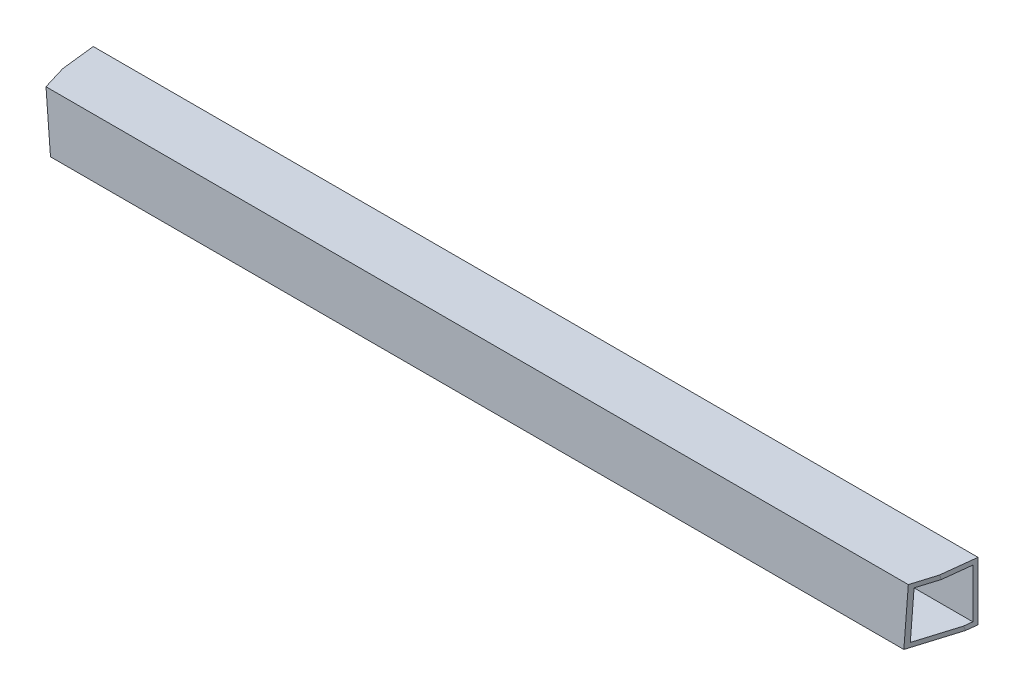
ISO-10303-21;
HEADER;
FILE_DESCRIPTION(('STEP AP214'),'2;1');
FILE_NAME('part.step','',(''),(''),'','','');
FILE_SCHEMA(('AUTOMOTIVE_DESIGN { 1 0 10303 214 1 1 1 1 }'));
ENDSEC;
DATA;
#1=APPLICATION_CONTEXT('core data for automotive mechanical design processes');
#2=APPLICATION_PROTOCOL_DEFINITION('international standard','automotive_design',2000,#1);
#3=PRODUCT_CONTEXT('',#1,'mechanical');
#4=PRODUCT('Part','Part','',(#3));
#5=PRODUCT_RELATED_PRODUCT_CATEGORY('part','',(#4));
#6=PRODUCT_DEFINITION_FORMATION('','',#4);
#7=PRODUCT_DEFINITION_CONTEXT('part definition',#1,'design');
#8=PRODUCT_DEFINITION('design','',#6,#7);
#9=PRODUCT_DEFINITION_SHAPE('','',#8);
#10=(LENGTH_UNIT() NAMED_UNIT(*) SI_UNIT(.MILLI.,.METRE.));
#11=(NAMED_UNIT(*) PLANE_ANGLE_UNIT() SI_UNIT($,.RADIAN.));
#12=(NAMED_UNIT(*) SI_UNIT($,.STERADIAN.) SOLID_ANGLE_UNIT());
#13=UNCERTAINTY_MEASURE_WITH_UNIT(LENGTH_MEASURE(1.E-05),#10,'distance_accuracy_value','');
#14=(GEOMETRIC_REPRESENTATION_CONTEXT(3) GLOBAL_UNCERTAINTY_ASSIGNED_CONTEXT((#13)) GLOBAL_UNIT_ASSIGNED_CONTEXT((#10,
#11,#12)) REPRESENTATION_CONTEXT('',''));
#15=CARTESIAN_POINT('',(0.,0.,0.));
#16=DIRECTION('',(0.,0.,1.));
#17=DIRECTION('',(1.,0.,0.));
#18=AXIS2_PLACEMENT_3D('',#15,#16,#17);
#19=CARTESIAN_POINT('',(-160.285714285715,-9.99999999999998,-924.999999999999));
#20=DIRECTION('',(0.,0.,1.));
#21=DIRECTION('',(1.,0.,0.));
#22=AXIS2_PLACEMENT_3D('',#19,#20,#21);
#23=PLANE('',#22);
#24=DIRECTION('',(0.,1.,0.));
#25=VECTOR('',#24,1.);
#26=CARTESIAN_POINT('',(151.363477169252,-9.99999999999998,-924.999999999999));
#27=LINE('',#26,#25);
#28=CARTESIAN_POINT('',(151.363477169252,-10.,-924.999999999999));
#29=VERTEX_POINT('',#28);
#30=CARTESIAN_POINT('',(151.363477169252,10.,-924.999999999999));
#31=VERTEX_POINT('',#30);
#32=EDGE_CURVE('E127',#29,#31,#27,.T.);
#33=ORIENTED_EDGE('',*,*,#32,.F.);
#34=DIRECTION('',(1.,0.,0.));
#35=VECTOR('',#34,1.);
#36=CARTESIAN_POINT('',(-160.285714285715,-9.99999999999998,-924.999999999999));
#37=LINE('',#36,#35);
#38=CARTESIAN_POINT('',(-151.363477169252,-10.,-924.999999999999));
#39=VERTEX_POINT('',#38);
#40=EDGE_CURVE('E138',#39,#29,#37,.T.);
#41=ORIENTED_EDGE('',*,*,#40,.F.);
#42=DIRECTION('',(0.,-1.,0.));
#43=VECTOR('',#42,1.);
#44=CARTESIAN_POINT('',(-151.363477169252,-9.99999999999998,-924.999999999999));
#45=LINE('',#44,#43);
#46=CARTESIAN_POINT('',(-151.363477169252,10.,-924.999999999999));
#47=VERTEX_POINT('',#46);
#48=EDGE_CURVE('E188',#47,#39,#45,.T.);
#49=ORIENTED_EDGE('',*,*,#48,.F.);
#50=DIRECTION('',(1.,0.,0.));
#51=VECTOR('',#50,1.);
#52=CARTESIAN_POINT('',(-160.285714285715,10.,-924.999999999999));
#53=LINE('',#52,#51);
#54=EDGE_CURVE('E140',#47,#31,#53,.T.);
#55=ORIENTED_EDGE('',*,*,#54,.T.);
#56=EDGE_LOOP('',(#33,#41,#49,#55));
#57=FACE_BOUND('',#56,.T.);
#58=ADVANCED_FACE('F39',(#57),#23,.F.);
#59=CARTESIAN_POINT('',(-160.285714285715,10.,-904.999999999999));
#60=DIRECTION('',(0.,-1.,0.));
#61=DIRECTION('',(1.,0.,0.));
#62=AXIS2_PLACEMENT_3D('',#59,#60,#61);
#63=PLANE('',#62);
#64=DIRECTION('',(-0.113546591160732,0.,0.993532672656404));
#65=VECTOR('',#64,1.);
#66=CARTESIAN_POINT('',(240.064673273436,10.,-1701.13546591161));
#67=LINE('',#66,#65);
#68=CARTESIAN_POINT('',(150.010616599401,10.,-913.162470013793));
#69=VERTEX_POINT('',#68);
#70=EDGE_CURVE('E132',#31,#69,#67,.T.);
#71=ORIENTED_EDGE('',*,*,#70,.F.);
#72=ORIENTED_EDGE('',*,*,#54,.F.);
#73=DIRECTION('',(0.113546591160732,0.,0.993532672656404));
#74=VECTOR('',#73,1.);
#75=CARTESIAN_POINT('',(-240.064673273436,10.,-1701.13546591161));
#76=LINE('',#75,#74);
#77=CARTESIAN_POINT('',(-150.0106165994,10.,-913.162470013789));
#78=VERTEX_POINT('',#77);
#79=EDGE_CURVE('E156',#47,#78,#76,.T.);
#80=ORIENTED_EDGE('',*,*,#79,.T.);
#81=DIRECTION('',(-0.291328168163367,0.,-0.956623174732129));
#82=VECTOR('',#81,1.);
#83=CARTESIAN_POINT('',(-148.607876541253,10.,-908.556346080738));
#84=LINE('',#83,#82);
#85=CARTESIAN_POINT('',(-147.52483379629,10.,-904.999999999999));
#86=VERTEX_POINT('',#85);
#87=EDGE_CURVE('E204',#86,#78,#84,.T.);
#88=ORIENTED_EDGE('',*,*,#87,.F.);
#89=DIRECTION('',(1.,0.,0.));
#90=VECTOR('',#89,1.);
#91=CARTESIAN_POINT('',(-160.285714285715,10.,-904.999999999999));
#92=LINE('',#91,#90);
#93=CARTESIAN_POINT('',(147.52483379629,10.,-904.999999999999));
#94=VERTEX_POINT('',#93);
#95=EDGE_CURVE('E157',#86,#94,#92,.T.);
#96=ORIENTED_EDGE('',*,*,#95,.T.);
#97=DIRECTION('',(-0.291328168163365,0.,0.956623174732129));
#98=VECTOR('',#97,1.);
#99=CARTESIAN_POINT('',(121.400305696566,10.,-819.215885244839));
#100=LINE('',#99,#98);
#101=EDGE_CURVE('E48',#69,#94,#100,.T.);
#102=ORIENTED_EDGE('',*,*,#101,.F.);
#103=EDGE_LOOP('',(#71,#72,#80,#88,#96,#102));
#104=FACE_BOUND('',#103,.T.);
#105=ADVANCED_FACE('F225',(#104),#63,.F.);
#106=CARTESIAN_POINT('',(-160.285714285715,-8.39999999999996,-906.599999999999));
#107=DIRECTION('',(0.,1.,0.));
#108=DIRECTION('',(0.,0.,1.));
#109=AXIS2_PLACEMENT_3D('',#106,#107,#108);
#110=PLANE('',#109);
#111=DIRECTION('',(0.291328168163365,0.,-0.956623174732129));
#112=VECTOR('',#111,1.);
#113=CARTESIAN_POINT('',(120.556458023637,-8.39999999999982,-821.072868980187));
#114=LINE('',#113,#112);
#115=CARTESIAN_POINT('',(146.602724794507,-8.39999999999996,-906.599999999999));
#116=VERTEX_POINT('',#115);
#117=CARTESIAN_POINT('',(150.857233460837,-8.39999999999996,-920.570367551372));
#118=VERTEX_POINT('',#117);
#119=EDGE_CURVE('E160',#116,#118,#114,.T.);
#120=ORIENTED_EDGE('',*,*,#119,.T.);
#121=DIRECTION('',(0.113546591160732,0.,-0.993532672656404));
#122=VECTOR('',#121,1.);
#123=CARTESIAN_POINT('',(145.269692267335,-8.39999999999991,-871.679382108222));
#124=LINE('',#123,#122);
#125=CARTESIAN_POINT('',(151.180620026395,-8.39999999999999,-923.399999999999));
#126=VERTEX_POINT('',#125);
#127=EDGE_CURVE('E219',#118,#126,#124,.T.);
#128=ORIENTED_EDGE('',*,*,#127,.T.);
#129=DIRECTION('',(1.,0.,0.));
#130=VECTOR('',#129,1.);
#131=CARTESIAN_POINT('',(-160.285714285715,-8.39999999999999,-923.399999999999));
#132=LINE('',#131,#130);
#133=CARTESIAN_POINT('',(-151.180620026395,-8.39999999999999,-923.399999999999));
#134=VERTEX_POINT('',#133);
#135=EDGE_CURVE('E166',#134,#126,#132,.T.);
#136=ORIENTED_EDGE('',*,*,#135,.F.);
#137=DIRECTION('',(0.113546591160732,0.,0.993532672656404));
#138=VECTOR('',#137,1.);
#139=CARTESIAN_POINT('',(-149.40276467438,-8.39999999999996,-907.843765669866));
#140=LINE('',#139,#138);
#141=CARTESIAN_POINT('',(-150.857233460838,-8.39999999999999,-920.570367551374));
#142=VERTEX_POINT('',#141);
#143=EDGE_CURVE('E181',#134,#142,#140,.T.);
#144=ORIENTED_EDGE('',*,*,#143,.T.);
#145=DIRECTION('',(0.291328168163366,0.,0.956623174732129));
#146=VECTOR('',#145,1.);
#147=CARTESIAN_POINT('',(-147.764028868323,-8.39999999999997,-910.413329816087));
#148=LINE('',#147,#146);
#149=CARTESIAN_POINT('',(-146.602724794507,-8.39999999999996,-906.599999999999));
#150=VERTEX_POINT('',#149);
#151=EDGE_CURVE('E152',#142,#150,#148,.T.);
#152=ORIENTED_EDGE('',*,*,#151,.T.);
#153=DIRECTION('',(1.,0.,0.));
#154=VECTOR('',#153,1.);
#155=CARTESIAN_POINT('',(-160.285714285715,-8.39999999999996,-906.599999999999));
#156=LINE('',#155,#154);
#157=EDGE_CURVE('E148',#150,#116,#156,.T.);
#158=ORIENTED_EDGE('',*,*,#157,.T.);
#159=EDGE_LOOP('',(#120,#128,#136,#144,#152,#158));
#160=FACE_BOUND('',#159,.T.);
#161=ADVANCED_FACE('F249',(#160),#110,.T.);
#162=CARTESIAN_POINT('',(-160.285714285715,-9.99999999999998,-904.999999999999));
#163=DIRECTION('',(0.,1.,0.));
#164=DIRECTION('',(-1.,0.,0.));
#165=AXIS2_PLACEMENT_3D('',#162,#163,#164);
#166=PLANE('',#165);
#167=DIRECTION('',(-0.113546591160732,0.,0.993532672656404));
#168=VECTOR('',#167,1.);
#169=CARTESIAN_POINT('',(240.064673273436,-10.,-1701.13546591161));
#170=LINE('',#169,#168);
#171=CARTESIAN_POINT('',(150.930852318355,-10.,-921.214532554648));
#172=VERTEX_POINT('',#171);
#173=EDGE_CURVE('E123',#29,#172,#170,.T.);
#174=ORIENTED_EDGE('',*,*,#173,.T.);
#175=DIRECTION('',(0.291328168163365,0.,-0.956623174732129));
#176=VECTOR('',#175,1.);
#177=CARTESIAN_POINT('',(119.998399483178,-9.99999999999998,-819.642819046853));
#178=LINE('',#177,#176);
#179=CARTESIAN_POINT('',(145.992909990026,-9.99999999999998,-904.999999999999));
#180=VERTEX_POINT('',#179);
#181=EDGE_CURVE('E183',#180,#172,#178,.T.);
#182=ORIENTED_EDGE('',*,*,#181,.F.);
#183=DIRECTION('',(1.,0.,0.));
#184=VECTOR('',#183,1.);
#185=CARTESIAN_POINT('',(-160.285714285715,-9.99999999999998,-904.999999999999));
#186=LINE('',#185,#184);
#187=CARTESIAN_POINT('',(-145.992909990026,-9.99999999999998,-904.999999999999));
#188=VERTEX_POINT('',#187);
#189=EDGE_CURVE('E161',#188,#180,#186,.T.);
#190=ORIENTED_EDGE('',*,*,#189,.F.);
#191=DIRECTION('',(0.291328168163367,0.,0.956623174732129));
#192=VECTOR('',#191,1.);
#193=CARTESIAN_POINT('',(-147.205970327865,-9.99999999999998,-908.983279882753));
#194=LINE('',#193,#192);
#195=CARTESIAN_POINT('',(-150.930852318354,-10.,-921.214532554642));
#196=VERTEX_POINT('',#195);
#197=EDGE_CURVE('E193',#196,#188,#194,.T.);
#198=ORIENTED_EDGE('',*,*,#197,.F.);
#199=DIRECTION('',(0.113546591160732,0.,0.993532672656404));
#200=VECTOR('',#199,1.);
#201=CARTESIAN_POINT('',(-240.064673273436,-10.,-1701.13546591161));
#202=LINE('',#201,#200);
#203=EDGE_CURVE('E146',#39,#196,#202,.T.);
#204=ORIENTED_EDGE('',*,*,#203,.F.);
#205=ORIENTED_EDGE('',*,*,#40,.T.);
#206=EDGE_LOOP('',(#174,#182,#190,#198,#204,#205));
#207=FACE_BOUND('',#206,.T.);
#208=ADVANCED_FACE('F144',(#207),#166,.F.);
#209=CARTESIAN_POINT('',(-160.285714285715,8.40000000000002,-906.599999999999));
#210=DIRECTION('',(0.,-1.,0.));
#211=DIRECTION('',(1.,0.,0.));
#212=AXIS2_PLACEMENT_3D('',#209,#210,#211);
#213=PLANE('',#212);
#214=DIRECTION('',(1.,0.,0.));
#215=VECTOR('',#214,1.);
#216=CARTESIAN_POINT('',(-160.285714285715,8.40000000000002,-923.399999999999));
#217=LINE('',#216,#215);
#218=CARTESIAN_POINT('',(-151.180620026395,8.40000000000002,-923.399999999999));
#219=VERTEX_POINT('',#218);
#220=CARTESIAN_POINT('',(151.180620026395,8.40000000000002,-923.399999999999));
#221=VERTEX_POINT('',#220);
#222=EDGE_CURVE('E168',#219,#221,#217,.T.);
#223=ORIENTED_EDGE('',*,*,#222,.T.);
#224=DIRECTION('',(-0.113546591160732,0.,0.993532672656404));
#225=VECTOR('',#224,1.);
#226=CARTESIAN_POINT('',(145.269692267335,8.40000000000002,-871.679382108222));
#227=LINE('',#226,#225);
#228=CARTESIAN_POINT('',(150.084235456915,8.40000000000002,-913.806635017051));
#229=VERTEX_POINT('',#228);
#230=EDGE_CURVE('E213',#221,#229,#227,.T.);
#231=ORIENTED_EDGE('',*,*,#230,.T.);
#232=DIRECTION('',(-0.291328168163365,0.,0.956623174732129));
#233=VECTOR('',#232,1.);
#234=CARTESIAN_POINT('',(121.734059242883,8.40000000000002,-820.714244586495));
#235=LINE('',#234,#233);
#236=CARTESIAN_POINT('',(147.889540791769,8.40000000000002,-906.599999999999));
#237=VERTEX_POINT('',#236);
#238=EDGE_CURVE('E147',#229,#237,#235,.T.);
#239=ORIENTED_EDGE('',*,*,#238,.T.);
#240=DIRECTION('',(1.,0.,0.));
#241=VECTOR('',#240,1.);
#242=CARTESIAN_POINT('',(-160.285714285715,8.40000000000002,-906.599999999999));
#243=LINE('',#242,#241);
#244=CARTESIAN_POINT('',(-147.889540791769,8.40000000000002,-906.599999999999));
#245=VERTEX_POINT('',#244);
#246=EDGE_CURVE('E164',#245,#237,#243,.T.);
#247=ORIENTED_EDGE('',*,*,#246,.F.);
#248=DIRECTION('',(-0.291328168163367,0.,-0.956623174732129));
#249=VECTOR('',#248,1.);
#250=CARTESIAN_POINT('',(-148.94163008757,8.40000000000002,-910.054705422395));
#251=LINE('',#250,#249);
#252=CARTESIAN_POINT('',(-150.084235456916,8.40000000000003,-913.806635017053));
#253=VERTEX_POINT('',#252);
#254=EDGE_CURVE('E149',#245,#253,#251,.T.);
#255=ORIENTED_EDGE('',*,*,#254,.T.);
#256=DIRECTION('',(-0.113546591160732,0.,-0.993532672656404));
#257=VECTOR('',#256,1.);
#258=CARTESIAN_POINT('',(-149.40276467438,8.40000000000002,-907.843765669866));
#259=LINE('',#258,#257);
#260=EDGE_CURVE('E175',#253,#219,#259,.T.);
#261=ORIENTED_EDGE('',*,*,#260,.T.);
#262=EDGE_LOOP('',(#223,#231,#239,#247,#255,#261));
#263=FACE_BOUND('',#262,.T.);
#264=ADVANCED_FACE('F232',(#263),#213,.T.);
#265=CARTESIAN_POINT('',(-160.285714285715,-8.39999999999999,-923.399999999999));
#266=DIRECTION('',(0.,0.,1.));
#267=DIRECTION('',(1.,0.,0.));
#268=AXIS2_PLACEMENT_3D('',#265,#266,#267);
#269=PLANE('',#268);
#270=ORIENTED_EDGE('',*,*,#135,.T.);
#271=DIRECTION('',(0.,1.,0.));
#272=VECTOR('',#271,1.);
#273=CARTESIAN_POINT('',(151.180620026395,-8.39999999999999,-923.399999999999));
#274=LINE('',#273,#272);
#275=EDGE_CURVE('E216',#126,#221,#274,.T.);
#276=ORIENTED_EDGE('',*,*,#275,.T.);
#277=ORIENTED_EDGE('',*,*,#222,.F.);
#278=DIRECTION('',(0.,-1.,0.));
#279=VECTOR('',#278,1.);
#280=CARTESIAN_POINT('',(-151.180620026395,-8.39999999999999,-923.399999999999));
#281=LINE('',#280,#279);
#282=EDGE_CURVE('E165',#219,#134,#281,.T.);
#283=ORIENTED_EDGE('',*,*,#282,.T.);
#284=EDGE_LOOP('',(#270,#276,#277,#283));
#285=FACE_BOUND('',#284,.T.);
#286=ADVANCED_FACE('F247',(#285),#269,.T.);
#287=CARTESIAN_POINT('',(148.208885848122,-9.00744130260019,-912.026870880227));
#288=DIRECTION('',(0.954065398667245,-0.0730777748475653,0.290549227996289));
#289=DIRECTION('',(0.291328168163365,0.,-0.956623174732129));
#290=AXIS2_PLACEMENT_3D('',#287,#288,#289);
#291=PLANE('',#290);
#292=ORIENTED_EDGE('',*,*,#181,.T.);
#293=DIRECTION('',(-0.0426436241126815,0.926797846123536,0.373131710985962));
#294=VECTOR('',#293,1.);
#295=CARTESIAN_POINT('',(150.740483346748,-5.86260416358649,-919.548804053086));
#296=LINE('',#295,#294);
#297=EDGE_CURVE('E11',#172,#118,#296,.T.);
#298=ORIENTED_EDGE('',*,*,#297,.T.);
#299=ORIENTED_EDGE('',*,*,#119,.F.);
#300=DIRECTION('',(-0.0763724801905248,-0.997079357057174,0.));
#301=VECTOR('',#300,1.);
#302=CARTESIAN_POINT('',(144.812719492852,-31.7693776979655,-906.599999999999));
#303=LINE('',#302,#301);
#304=EDGE_CURVE('E172',#237,#116,#303,.T.);
#305=ORIENTED_EDGE('',*,*,#304,.F.);
#306=ORIENTED_EDGE('',*,*,#238,.F.);
#307=DIRECTION('',(-0.0426436241126815,0.926797846123536,0.373131710985962));
#308=VECTOR('',#307,1.);
#309=CARTESIAN_POINT('',(151.641033769275,-25.4347725543154,-927.428620250204));
#310=LINE('',#309,#308);
#311=EDGE_CURVE('E141',#229,#69,#310,.T.);
#312=ORIENTED_EDGE('',*,*,#311,.T.);
#313=ORIENTED_EDGE('',*,*,#101,.T.);
#314=DIRECTION('',(-0.0763724801905248,-0.997079357057174,0.));
#315=VECTOR('',#314,1.);
#316=CARTESIAN_POINT('',(144.206461589167,-33.3229406521959,-904.999999999999));
#317=LINE('',#316,#315);
#318=EDGE_CURVE('E54',#94,#180,#317,.T.);
#319=ORIENTED_EDGE('',*,*,#318,.T.);
#320=EDGE_LOOP('',(#292,#298,#299,#305,#306,#312,#313,#319));
#321=FACE_BOUND('',#320,.T.);
#322=ADVANCED_FACE('F41',(#321),#291,.T.);
#323=CARTESIAN_POINT('',(-160.285714285715,-9.99999999999998,-904.999999999999));
#324=DIRECTION('',(0.,0.,-1.));
#325=DIRECTION('',(-1.,0.,0.));
#326=AXIS2_PLACEMENT_3D('',#323,#324,#325);
#327=PLANE('',#326);
#328=ORIENTED_EDGE('',*,*,#318,.F.);
#329=ORIENTED_EDGE('',*,*,#95,.F.);
#330=DIRECTION('',(-0.0763724801905252,0.997079357057174,0.));
#331=VECTOR('',#330,1.);
#332=CARTESIAN_POINT('',(-146.076276426186,-8.91161119346779,-904.999999999999));
#333=LINE('',#332,#331);
#334=EDGE_CURVE('E192',#188,#86,#333,.T.);
#335=ORIENTED_EDGE('',*,*,#334,.F.);
#336=ORIENTED_EDGE('',*,*,#189,.T.);
#337=EDGE_LOOP('',(#328,#329,#335,#336));
#338=FACE_BOUND('',#337,.T.);
#339=ADVANCED_FACE('F253',(#338),#327,.F.);
#340=CARTESIAN_POINT('',(-160.285714285715,-8.39999999999996,-906.599999999999));
#341=DIRECTION('',(0.,0.,-1.));
#342=DIRECTION('',(-1.,0.,0.));
#343=AXIS2_PLACEMENT_3D('',#340,#341,#342);
#344=PLANE('',#343);
#345=ORIENTED_EDGE('',*,*,#246,.T.);
#346=ORIENTED_EDGE('',*,*,#304,.T.);
#347=ORIENTED_EDGE('',*,*,#157,.F.);
#348=DIRECTION('',(-0.0763724801905252,0.997079357057174,0.));
#349=VECTOR('',#348,1.);
#350=CARTESIAN_POINT('',(-146.682534329871,-7.35804823923735,-906.599999999999));
#351=LINE('',#350,#349);
#352=EDGE_CURVE('E177',#150,#245,#351,.T.);
#353=ORIENTED_EDGE('',*,*,#352,.T.);
#354=EDGE_LOOP('',(#345,#346,#347,#353));
#355=FACE_BOUND('',#354,.T.);
#356=ADVANCED_FACE('F234',(#355),#344,.T.);
#357=CARTESIAN_POINT('',(-148.208885848122,-9.00744130260023,-912.026870880227));
#358=DIRECTION('',(-0.954065398667244,-0.0730777748475656,0.29054922799629));
#359=DIRECTION('',(0.291328168163367,0.,0.956623174732129));
#360=AXIS2_PLACEMENT_3D('',#357,#358,#359);
#361=PLANE('',#360);
#362=ORIENTED_EDGE('',*,*,#197,.T.);
#363=ORIENTED_EDGE('',*,*,#334,.T.);
#364=ORIENTED_EDGE('',*,*,#87,.T.);
#365=DIRECTION('',(-0.0426436241126812,-0.926797846123536,-0.373131710985961));
#366=VECTOR('',#365,1.);
#367=CARTESIAN_POINT('',(-151.641033769276,-25.4347725543153,-927.428620250206));
#368=LINE('',#367,#366);
#369=EDGE_CURVE('E189',#78,#253,#368,.T.);
#370=ORIENTED_EDGE('',*,*,#369,.T.);
#371=ORIENTED_EDGE('',*,*,#254,.F.);
#372=ORIENTED_EDGE('',*,*,#352,.F.);
#373=ORIENTED_EDGE('',*,*,#151,.F.);
#374=DIRECTION('',(-0.0426436241126812,-0.926797846123536,-0.373131710985961));
#375=VECTOR('',#374,1.);
#376=CARTESIAN_POINT('',(-150.740483346748,-5.86260416358602,-919.548804053088));
#377=LINE('',#376,#375);
#378=EDGE_CURVE('E200',#142,#196,#377,.T.);
#379=ORIENTED_EDGE('',*,*,#378,.T.);
#380=EDGE_LOOP('',(#362,#363,#364,#370,#371,#372,#373,#379));
#381=FACE_BOUND('',#380,.T.);
#382=ADVANCED_FACE('F240',(#381),#361,.T.);
#383=CARTESIAN_POINT('',(-240.064673273436,-10.,-1701.13546591161));
#384=DIRECTION('',(-0.993532672656404,0.,0.113546591160732));
#385=DIRECTION('',(0.113546591160732,0.,0.993532672656404));
#386=AXIS2_PLACEMENT_3D('',#383,#384,#385);
#387=PLANE('',#386);
#388=ORIENTED_EDGE('',*,*,#48,.T.);
#389=ORIENTED_EDGE('',*,*,#203,.T.);
#390=ORIENTED_EDGE('',*,*,#378,.F.);
#391=ORIENTED_EDGE('',*,*,#143,.F.);
#392=ORIENTED_EDGE('',*,*,#282,.F.);
#393=ORIENTED_EDGE('',*,*,#260,.F.);
#394=ORIENTED_EDGE('',*,*,#369,.F.);
#395=ORIENTED_EDGE('',*,*,#79,.F.);
#396=EDGE_LOOP('',(#388,#389,#390,#391,#392,#393,#394,#395));
#397=FACE_BOUND('',#396,.T.);
#398=ADVANCED_FACE('F244',(#397),#387,.T.);
#399=CARTESIAN_POINT('',(240.064673273436,10.,-1701.13546591161));
#400=DIRECTION('',(0.993532672656404,0.,0.113546591160732));
#401=DIRECTION('',(0.113546591160732,0.,-0.993532672656404));
#402=AXIS2_PLACEMENT_3D('',#399,#400,#401);
#403=PLANE('',#402);
#404=ORIENTED_EDGE('',*,*,#32,.T.);
#405=ORIENTED_EDGE('',*,*,#70,.T.);
#406=ORIENTED_EDGE('',*,*,#311,.F.);
#407=ORIENTED_EDGE('',*,*,#230,.F.);
#408=ORIENTED_EDGE('',*,*,#275,.F.);
#409=ORIENTED_EDGE('',*,*,#127,.F.);
#410=ORIENTED_EDGE('',*,*,#297,.F.);
#411=ORIENTED_EDGE('',*,*,#173,.F.);
#412=EDGE_LOOP('',(#404,#405,#406,#407,#408,#409,#410,#411));
#413=FACE_BOUND('',#412,.T.);
#414=ADVANCED_FACE('F125',(#413),#403,.T.);
#415=CLOSED_SHELL('',(#58,#105,#161,#208,#264,#286,#322,#339,#356,#382,#398,#414));
#416=MANIFOLD_SOLID_BREP('B2',#415);
#417=ADVANCED_BREP_SHAPE_REPRESENTATION('',(#18,#416),#14);
#418=SHAPE_DEFINITION_REPRESENTATION(#9,#417);
ENDSEC;
END-ISO-10303-21;
